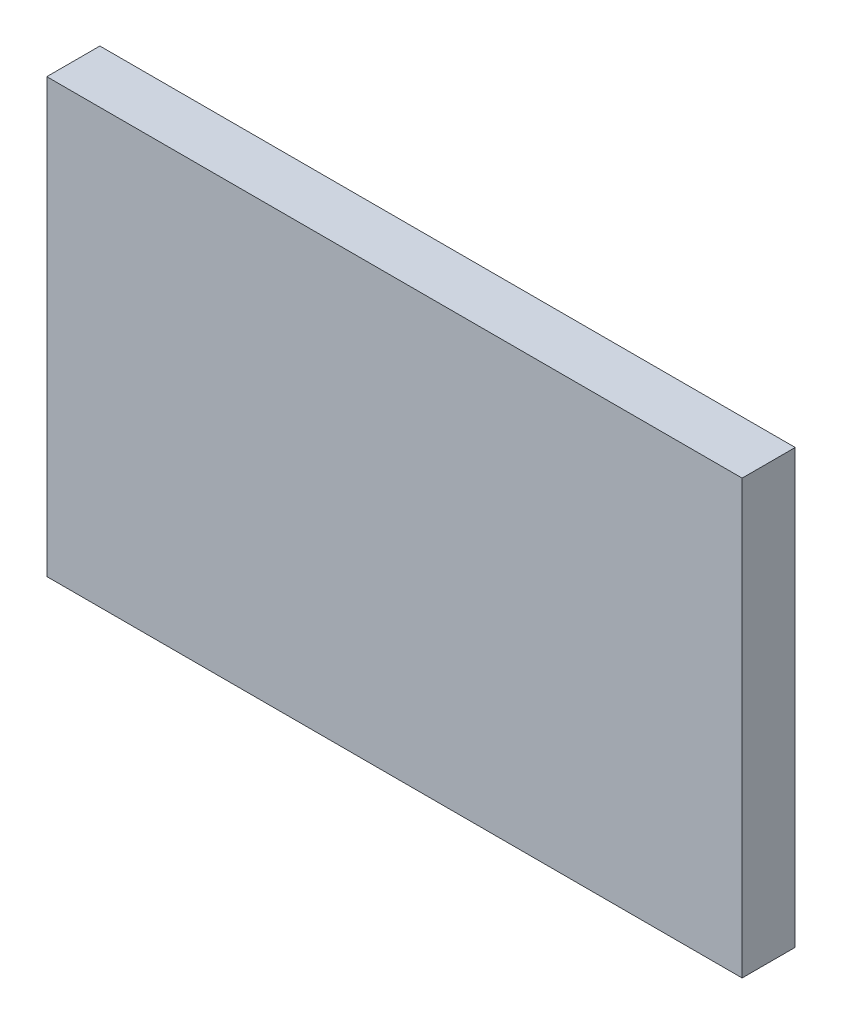
ISO-10303-21;
HEADER;
FILE_DESCRIPTION(('STEP AP214'),'2;1');
FILE_NAME('part.step','',(''),(''),'','','');
FILE_SCHEMA(('AUTOMOTIVE_DESIGN { 1 0 10303 214 1 1 1 1 }'));
ENDSEC;
DATA;
#1=APPLICATION_CONTEXT('core data for automotive mechanical design processes');
#2=APPLICATION_PROTOCOL_DEFINITION('international standard','automotive_design',2000,#1);
#3=PRODUCT_CONTEXT('',#1,'mechanical');
#4=PRODUCT('Part','Part','',(#3));
#5=PRODUCT_RELATED_PRODUCT_CATEGORY('part','',(#4));
#6=PRODUCT_DEFINITION_FORMATION('','',#4);
#7=PRODUCT_DEFINITION_CONTEXT('part definition',#1,'design');
#8=PRODUCT_DEFINITION('design','',#6,#7);
#9=PRODUCT_DEFINITION_SHAPE('','',#8);
#10=(LENGTH_UNIT() NAMED_UNIT(*) SI_UNIT(.MILLI.,.METRE.));
#11=(NAMED_UNIT(*) PLANE_ANGLE_UNIT() SI_UNIT($,.RADIAN.));
#12=(NAMED_UNIT(*) SI_UNIT($,.STERADIAN.) SOLID_ANGLE_UNIT());
#13=UNCERTAINTY_MEASURE_WITH_UNIT(LENGTH_MEASURE(1.E-05),#10,'distance_accuracy_value','');
#14=(GEOMETRIC_REPRESENTATION_CONTEXT(3) GLOBAL_UNCERTAINTY_ASSIGNED_CONTEXT((#13)) GLOBAL_UNIT_ASSIGNED_CONTEXT((#10,
#11,#12)) REPRESENTATION_CONTEXT('',''));
#15=CARTESIAN_POINT('',(0.,0.,0.));
#16=DIRECTION('',(0.,0.,1.));
#17=DIRECTION('',(1.,0.,0.));
#18=AXIS2_PLACEMENT_3D('',#15,#16,#17);
#19=CARTESIAN_POINT('',(-17.6929523809524,-5.33390476190476,2.68));
#20=DIRECTION('',(1.,0.,0.));
#21=DIRECTION('',(0.,0.,-1.));
#22=AXIS2_PLACEMENT_3D('',#19,#20,#21);
#23=PLANE('',#22);
#24=DIRECTION('',(0.,-1.,0.));
#25=VECTOR('',#24,1.);
#26=CARTESIAN_POINT('',(-17.6929523809524,-5.33390476190476,0.));
#27=LINE('',#26,#25);
#28=CARTESIAN_POINT('',(-17.6929523809524,16.5220952380952,0.));
#29=VERTEX_POINT('',#28);
#30=CARTESIAN_POINT('',(-17.6929523809524,-5.33390476190476,0.));
#31=VERTEX_POINT('',#30);
#32=EDGE_CURVE('E95',#29,#31,#27,.T.);
#33=ORIENTED_EDGE('',*,*,#32,.T.);
#34=DIRECTION('',(0.,0.,-1.));
#35=VECTOR('',#34,1.);
#36=CARTESIAN_POINT('',(-17.6929523809524,-5.33390476190476,2.68));
#37=LINE('',#36,#35);
#38=CARTESIAN_POINT('',(-17.6929523809524,-5.33390476190476,2.68));
#39=VERTEX_POINT('',#38);
#40=EDGE_CURVE('E11',#39,#31,#37,.T.);
#41=ORIENTED_EDGE('',*,*,#40,.F.);
#42=DIRECTION('',(0.,-1.,0.));
#43=VECTOR('',#42,1.);
#44=CARTESIAN_POINT('',(-17.6929523809524,-5.33390476190476,2.68));
#45=LINE('',#44,#43);
#46=CARTESIAN_POINT('',(-17.6929523809524,16.5220952380952,2.68));
#47=VERTEX_POINT('',#46);
#48=EDGE_CURVE('E83',#47,#39,#45,.T.);
#49=ORIENTED_EDGE('',*,*,#48,.F.);
#50=DIRECTION('',(0.,0.,-1.));
#51=VECTOR('',#50,1.);
#52=CARTESIAN_POINT('',(-17.6929523809524,16.5220952380952,2.68));
#53=LINE('',#52,#51);
#54=EDGE_CURVE('E91',#47,#29,#53,.T.);
#55=ORIENTED_EDGE('',*,*,#54,.T.);
#56=EDGE_LOOP('',(#33,#41,#49,#55));
#57=FACE_BOUND('',#56,.T.);
#58=ADVANCED_FACE('F32',(#57),#23,.F.);
#59=CARTESIAN_POINT('',(-17.6929523809524,-5.33390476190476,2.68));
#60=DIRECTION('',(0.,1.,0.));
#61=DIRECTION('',(-1.,0.,0.));
#62=AXIS2_PLACEMENT_3D('',#59,#60,#61);
#63=PLANE('',#62);
#64=DIRECTION('',(1.,0.,0.));
#65=VECTOR('',#64,1.);
#66=CARTESIAN_POINT('',(-17.6929523809524,-5.33390476190476,0.));
#67=LINE('',#66,#65);
#68=CARTESIAN_POINT('',(17.4110476190476,-5.33390476190476,0.));
#69=VERTEX_POINT('',#68);
#70=EDGE_CURVE('E87',#31,#69,#67,.T.);
#71=ORIENTED_EDGE('',*,*,#70,.T.);
#72=DIRECTION('',(0.,0.,-1.));
#73=VECTOR('',#72,1.);
#74=CARTESIAN_POINT('',(17.4110476190476,-5.33390476190476,2.68));
#75=LINE('',#74,#73);
#76=CARTESIAN_POINT('',(17.4110476190476,-5.33390476190476,2.68));
#77=VERTEX_POINT('',#76);
#78=EDGE_CURVE('E40',#77,#69,#75,.T.);
#79=ORIENTED_EDGE('',*,*,#78,.F.);
#80=DIRECTION('',(1.,0.,0.));
#81=VECTOR('',#80,1.);
#82=CARTESIAN_POINT('',(-17.6929523809524,-5.33390476190476,2.68));
#83=LINE('',#82,#81);
#84=EDGE_CURVE('E78',#39,#77,#83,.T.);
#85=ORIENTED_EDGE('',*,*,#84,.F.);
#86=ORIENTED_EDGE('',*,*,#40,.T.);
#87=EDGE_LOOP('',(#71,#79,#85,#86));
#88=FACE_BOUND('',#87,.T.);
#89=ADVANCED_FACE('F86',(#88),#63,.F.);
#90=CARTESIAN_POINT('',(17.4110476190476,-5.33390476190476,2.68));
#91=DIRECTION('',(-1.,0.,0.));
#92=DIRECTION('',(0.,0.,1.));
#93=AXIS2_PLACEMENT_3D('',#90,#91,#92);
#94=PLANE('',#93);
#95=DIRECTION('',(0.,1.,0.));
#96=VECTOR('',#95,1.);
#97=CARTESIAN_POINT('',(17.4110476190476,-5.33390476190476,0.));
#98=LINE('',#97,#96);
#99=CARTESIAN_POINT('',(17.4110476190476,16.5220952380952,0.));
#100=VERTEX_POINT('',#99);
#101=EDGE_CURVE('E65',#69,#100,#98,.T.);
#102=ORIENTED_EDGE('',*,*,#101,.T.);
#103=DIRECTION('',(0.,0.,-1.));
#104=VECTOR('',#103,1.);
#105=CARTESIAN_POINT('',(17.4110476190476,16.5220952380952,2.68));
#106=LINE('',#105,#104);
#107=CARTESIAN_POINT('',(17.4110476190476,16.5220952380952,2.68));
#108=VERTEX_POINT('',#107);
#109=EDGE_CURVE('E88',#108,#100,#106,.T.);
#110=ORIENTED_EDGE('',*,*,#109,.F.);
#111=DIRECTION('',(0.,1.,0.));
#112=VECTOR('',#111,1.);
#113=CARTESIAN_POINT('',(17.4110476190476,-5.33390476190476,2.68));
#114=LINE('',#113,#112);
#115=EDGE_CURVE('E81',#77,#108,#114,.T.);
#116=ORIENTED_EDGE('',*,*,#115,.F.);
#117=ORIENTED_EDGE('',*,*,#78,.T.);
#118=EDGE_LOOP('',(#102,#110,#116,#117));
#119=FACE_BOUND('',#118,.T.);
#120=ADVANCED_FACE('F89',(#119),#94,.F.);
#121=CARTESIAN_POINT('',(-17.6929523809524,16.5220952380952,2.68));
#122=DIRECTION('',(0.,-1.,0.));
#123=DIRECTION('',(0.,0.,-1.));
#124=AXIS2_PLACEMENT_3D('',#121,#122,#123);
#125=PLANE('',#124);
#126=DIRECTION('',(-1.,0.,0.));
#127=VECTOR('',#126,1.);
#128=CARTESIAN_POINT('',(-17.6929523809524,16.5220952380952,0.));
#129=LINE('',#128,#127);
#130=EDGE_CURVE('E71',#100,#29,#129,.T.);
#131=ORIENTED_EDGE('',*,*,#130,.T.);
#132=ORIENTED_EDGE('',*,*,#54,.F.);
#133=DIRECTION('',(-1.,0.,0.));
#134=VECTOR('',#133,1.);
#135=CARTESIAN_POINT('',(-17.6929523809524,16.5220952380952,2.68));
#136=LINE('',#135,#134);
#137=EDGE_CURVE('E48',#108,#47,#136,.T.);
#138=ORIENTED_EDGE('',*,*,#137,.F.);
#139=ORIENTED_EDGE('',*,*,#109,.T.);
#140=EDGE_LOOP('',(#131,#132,#138,#139));
#141=FACE_BOUND('',#140,.T.);
#142=ADVANCED_FACE('F102',(#141),#125,.F.);
#143=CARTESIAN_POINT('',(0.,0.,2.68));
#144=DIRECTION('',(0.,0.,-1.));
#145=DIRECTION('',(-1.,0.,0.));
#146=AXIS2_PLACEMENT_3D('',#143,#144,#145);
#147=PLANE('',#146);
#148=ORIENTED_EDGE('',*,*,#48,.T.);
#149=ORIENTED_EDGE('',*,*,#84,.T.);
#150=ORIENTED_EDGE('',*,*,#115,.T.);
#151=ORIENTED_EDGE('',*,*,#137,.T.);
#152=EDGE_LOOP('',(#148,#149,#150,#151));
#153=FACE_BOUND('',#152,.T.);
#154=ADVANCED_FACE('F79',(#153),#147,.F.);
#155=CARTESIAN_POINT('',(0.,0.,0.));
#156=DIRECTION('',(0.,0.,-1.));
#157=DIRECTION('',(-1.,0.,0.));
#158=AXIS2_PLACEMENT_3D('',#155,#156,#157);
#159=PLANE('',#158);
#160=ORIENTED_EDGE('',*,*,#32,.F.);
#161=ORIENTED_EDGE('',*,*,#130,.F.);
#162=ORIENTED_EDGE('',*,*,#101,.F.);
#163=ORIENTED_EDGE('',*,*,#70,.F.);
#164=EDGE_LOOP('',(#160,#161,#162,#163));
#165=FACE_BOUND('',#164,.T.);
#166=ADVANCED_FACE('F105',(#165),#159,.T.);
#167=CLOSED_SHELL('',(#58,#89,#120,#142,#154,#166));
#168=MANIFOLD_SOLID_BREP('B2',#167);
#169=ADVANCED_BREP_SHAPE_REPRESENTATION('',(#18,#168),#14);
#170=SHAPE_DEFINITION_REPRESENTATION(#9,#169);
ENDSEC;
END-ISO-10303-21;
